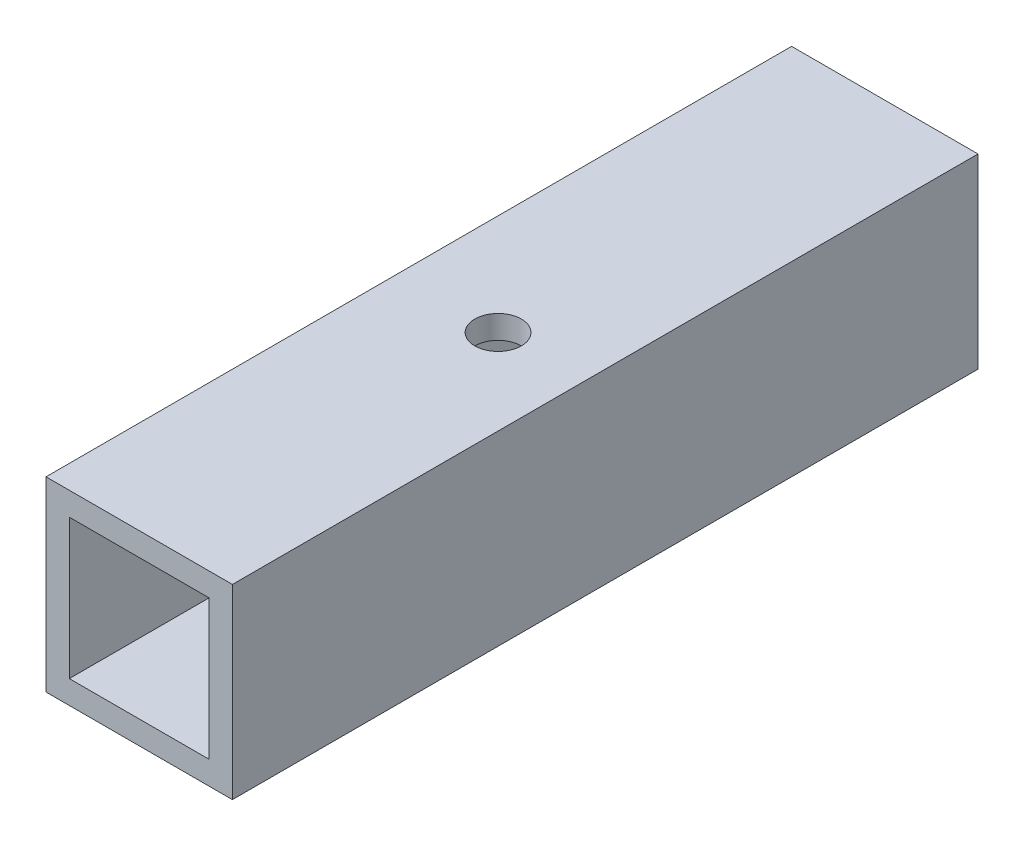
ISO-10303-21;
HEADER;
FILE_DESCRIPTION(('STEP AP214'),'2;1');
FILE_NAME('part.step','',(''),(''),'','','');
FILE_SCHEMA(('AUTOMOTIVE_DESIGN { 1 0 10303 214 1 1 1 1 }'));
ENDSEC;
DATA;
#1=APPLICATION_CONTEXT('core data for automotive mechanical design processes');
#2=APPLICATION_PROTOCOL_DEFINITION('international standard','automotive_design',2000,#1);
#3=PRODUCT_CONTEXT('',#1,'mechanical');
#4=PRODUCT('Part','Part','',(#3));
#5=PRODUCT_RELATED_PRODUCT_CATEGORY('part','',(#4));
#6=PRODUCT_DEFINITION_FORMATION('','',#4);
#7=PRODUCT_DEFINITION_CONTEXT('part definition',#1,'design');
#8=PRODUCT_DEFINITION('design','',#6,#7);
#9=PRODUCT_DEFINITION_SHAPE('','',#8);
#10=(LENGTH_UNIT() NAMED_UNIT(*) SI_UNIT(.MILLI.,.METRE.));
#11=(NAMED_UNIT(*) PLANE_ANGLE_UNIT() SI_UNIT($,.RADIAN.));
#12=(NAMED_UNIT(*) SI_UNIT($,.STERADIAN.) SOLID_ANGLE_UNIT());
#13=UNCERTAINTY_MEASURE_WITH_UNIT(LENGTH_MEASURE(1.E-05),#10,'distance_accuracy_value','');
#14=(GEOMETRIC_REPRESENTATION_CONTEXT(3) GLOBAL_UNCERTAINTY_ASSIGNED_CONTEXT((#13)) GLOBAL_UNIT_ASSIGNED_CONTEXT((#10,
#11,#12)) REPRESENTATION_CONTEXT('',''));
#15=CARTESIAN_POINT('',(0.,0.,0.));
#16=DIRECTION('',(0.,0.,1.));
#17=DIRECTION('',(1.,0.,0.));
#18=AXIS2_PLACEMENT_3D('',#15,#16,#17);
#19=CARTESIAN_POINT('',(0.,0.,101.6));
#20=DIRECTION('',(0.,0.,-1.));
#21=DIRECTION('',(-1.,0.,0.));
#22=AXIS2_PLACEMENT_3D('',#19,#20,#21);
#23=PLANE('',#22);
#24=DIRECTION('',(0.,-1.,0.));
#25=VECTOR('',#24,1.);
#26=CARTESIAN_POINT('',(0.,0.,101.6));
#27=LINE('',#26,#25);
#28=CARTESIAN_POINT('',(0.,25.4,101.6));
#29=VERTEX_POINT('',#28);
#30=CARTESIAN_POINT('',(0.,0.,101.6));
#31=VERTEX_POINT('',#30);
#32=EDGE_CURVE('E150',#29,#31,#27,.T.);
#33=ORIENTED_EDGE('',*,*,#32,.T.);
#34=DIRECTION('',(1.,0.,0.));
#35=VECTOR('',#34,1.);
#36=CARTESIAN_POINT('',(0.,0.,101.6));
#37=LINE('',#36,#35);
#38=CARTESIAN_POINT('',(25.4,0.,101.6));
#39=VERTEX_POINT('',#38);
#40=EDGE_CURVE('E154',#31,#39,#37,.T.);
#41=ORIENTED_EDGE('',*,*,#40,.T.);
#42=DIRECTION('',(0.,1.,0.));
#43=VECTOR('',#42,1.);
#44=CARTESIAN_POINT('',(25.4,0.,101.6));
#45=LINE('',#44,#43);
#46=CARTESIAN_POINT('',(25.4,25.4,101.6));
#47=VERTEX_POINT('',#46);
#48=EDGE_CURVE('E157',#39,#47,#45,.T.);
#49=ORIENTED_EDGE('',*,*,#48,.T.);
#50=DIRECTION('',(-1.,0.,0.));
#51=VECTOR('',#50,1.);
#52=CARTESIAN_POINT('',(0.,25.4,101.6));
#53=LINE('',#52,#51);
#54=EDGE_CURVE('E159',#47,#29,#53,.T.);
#55=ORIENTED_EDGE('',*,*,#54,.T.);
#56=EDGE_LOOP('',(#33,#41,#49,#55));
#57=FACE_BOUND('',#56,.T.);
#58=DIRECTION('',(0.,-1.,0.));
#59=VECTOR('',#58,1.);
#60=CARTESIAN_POINT('',(3.175,3.175,101.6));
#61=LINE('',#60,#59);
#62=CARTESIAN_POINT('',(3.175,22.225,101.6));
#63=VERTEX_POINT('',#62);
#64=CARTESIAN_POINT('',(3.175,3.175,101.6));
#65=VERTEX_POINT('',#64);
#66=EDGE_CURVE('E108',#63,#65,#61,.T.);
#67=ORIENTED_EDGE('',*,*,#66,.F.);
#68=DIRECTION('',(-1.,0.,0.));
#69=VECTOR('',#68,1.);
#70=CARTESIAN_POINT('',(3.175,22.225,101.6));
#71=LINE('',#70,#69);
#72=CARTESIAN_POINT('',(22.225,22.225,101.6));
#73=VERTEX_POINT('',#72);
#74=EDGE_CURVE('E132',#73,#63,#71,.T.);
#75=ORIENTED_EDGE('',*,*,#74,.F.);
#76=DIRECTION('',(0.,1.,0.));
#77=VECTOR('',#76,1.);
#78=CARTESIAN_POINT('',(22.225,3.175,101.6));
#79=LINE('',#78,#77);
#80=CARTESIAN_POINT('',(22.225,3.175,101.6));
#81=VERTEX_POINT('',#80);
#82=EDGE_CURVE('E130',#81,#73,#79,.T.);
#83=ORIENTED_EDGE('',*,*,#82,.F.);
#84=DIRECTION('',(1.,0.,0.));
#85=VECTOR('',#84,1.);
#86=CARTESIAN_POINT('',(3.175,3.175,101.6));
#87=LINE('',#86,#85);
#88=EDGE_CURVE('E117',#65,#81,#87,.T.);
#89=ORIENTED_EDGE('',*,*,#88,.F.);
#90=EDGE_LOOP('',(#67,#75,#83,#89));
#91=FACE_BOUND('',#90,.T.);
#92=ADVANCED_FACE('F39',(#57,#91),#23,.F.);
#93=CARTESIAN_POINT('',(0.,0.,0.));
#94=DIRECTION('',(0.,0.,-1.));
#95=DIRECTION('',(-1.,0.,0.));
#96=AXIS2_PLACEMENT_3D('',#93,#94,#95);
#97=PLANE('',#96);
#98=DIRECTION('',(0.,-1.,0.));
#99=VECTOR('',#98,1.);
#100=CARTESIAN_POINT('',(0.,0.,0.));
#101=LINE('',#100,#99);
#102=CARTESIAN_POINT('',(0.,25.4,0.));
#103=VERTEX_POINT('',#102);
#104=CARTESIAN_POINT('',(0.,0.,0.));
#105=VERTEX_POINT('',#104);
#106=EDGE_CURVE('E126',#103,#105,#101,.T.);
#107=ORIENTED_EDGE('',*,*,#106,.F.);
#108=DIRECTION('',(-1.,0.,0.));
#109=VECTOR('',#108,1.);
#110=CARTESIAN_POINT('',(0.,25.4,0.));
#111=LINE('',#110,#109);
#112=CARTESIAN_POINT('',(25.4,25.4,0.));
#113=VERTEX_POINT('',#112);
#114=EDGE_CURVE('E155',#113,#103,#111,.T.);
#115=ORIENTED_EDGE('',*,*,#114,.F.);
#116=DIRECTION('',(0.,1.,0.));
#117=VECTOR('',#116,1.);
#118=CARTESIAN_POINT('',(25.4,0.,0.));
#119=LINE('',#118,#117);
#120=CARTESIAN_POINT('',(25.4,0.,0.));
#121=VERTEX_POINT('',#120);
#122=EDGE_CURVE('E167',#121,#113,#119,.T.);
#123=ORIENTED_EDGE('',*,*,#122,.F.);
#124=DIRECTION('',(1.,0.,0.));
#125=VECTOR('',#124,1.);
#126=CARTESIAN_POINT('',(0.,0.,0.));
#127=LINE('',#126,#125);
#128=EDGE_CURVE('E165',#105,#121,#127,.T.);
#129=ORIENTED_EDGE('',*,*,#128,.F.);
#130=EDGE_LOOP('',(#107,#115,#123,#129));
#131=FACE_BOUND('',#130,.T.);
#132=DIRECTION('',(-1.,0.,0.));
#133=VECTOR('',#132,1.);
#134=CARTESIAN_POINT('',(3.175,22.225,0.));
#135=LINE('',#134,#133);
#136=CARTESIAN_POINT('',(22.225,22.225,0.));
#137=VERTEX_POINT('',#136);
#138=CARTESIAN_POINT('',(3.175,22.225,0.));
#139=VERTEX_POINT('',#138);
#140=EDGE_CURVE('E118',#137,#139,#135,.T.);
#141=ORIENTED_EDGE('',*,*,#140,.T.);
#142=DIRECTION('',(0.,-1.,0.));
#143=VECTOR('',#142,1.);
#144=CARTESIAN_POINT('',(3.175,3.175,0.));
#145=LINE('',#144,#143);
#146=CARTESIAN_POINT('',(3.175,3.175,0.));
#147=VERTEX_POINT('',#146);
#148=EDGE_CURVE('E63',#139,#147,#145,.T.);
#149=ORIENTED_EDGE('',*,*,#148,.T.);
#150=DIRECTION('',(1.,0.,0.));
#151=VECTOR('',#150,1.);
#152=CARTESIAN_POINT('',(3.175,3.175,0.));
#153=LINE('',#152,#151);
#154=CARTESIAN_POINT('',(22.225,3.175,0.));
#155=VERTEX_POINT('',#154);
#156=EDGE_CURVE('E124',#147,#155,#153,.T.);
#157=ORIENTED_EDGE('',*,*,#156,.T.);
#158=DIRECTION('',(0.,1.,0.));
#159=VECTOR('',#158,1.);
#160=CARTESIAN_POINT('',(22.225,3.175,0.));
#161=LINE('',#160,#159);
#162=EDGE_CURVE('E141',#155,#137,#161,.T.);
#163=ORIENTED_EDGE('',*,*,#162,.T.);
#164=EDGE_LOOP('',(#141,#149,#157,#163));
#165=FACE_BOUND('',#164,.T.);
#166=ADVANCED_FACE('F187',(#131,#165),#97,.T.);
#167=CARTESIAN_POINT('',(0.,0.,101.6));
#168=DIRECTION('',(1.,0.,0.));
#169=DIRECTION('',(0.,0.,-1.));
#170=AXIS2_PLACEMENT_3D('',#167,#168,#169);
#171=PLANE('',#170);
#172=ORIENTED_EDGE('',*,*,#106,.T.);
#173=DIRECTION('',(0.,0.,-1.));
#174=VECTOR('',#173,1.);
#175=CARTESIAN_POINT('',(0.,0.,101.6));
#176=LINE('',#175,#174);
#177=EDGE_CURVE('E11',#31,#105,#176,.T.);
#178=ORIENTED_EDGE('',*,*,#177,.F.);
#179=ORIENTED_EDGE('',*,*,#32,.F.);
#180=DIRECTION('',(0.,0.,-1.));
#181=VECTOR('',#180,1.);
#182=CARTESIAN_POINT('',(0.,25.4,101.6));
#183=LINE('',#182,#181);
#184=EDGE_CURVE('E162',#29,#103,#183,.T.);
#185=ORIENTED_EDGE('',*,*,#184,.T.);
#186=EDGE_LOOP('',(#172,#178,#179,#185));
#187=FACE_BOUND('',#186,.T.);
#188=ADVANCED_FACE('F41',(#187),#171,.F.);
#189=CARTESIAN_POINT('',(0.,0.,101.6));
#190=DIRECTION('',(0.,1.,0.));
#191=DIRECTION('',(0.,0.,1.));
#192=AXIS2_PLACEMENT_3D('',#189,#190,#191);
#193=PLANE('',#192);
#194=CARTESIAN_POINT('',(13.7663674383033,0.,53.7644274293484));
#195=DIRECTION('',(0.,1.,0.));
#196=DIRECTION('',(-0.800064361150527,0.,-0.599914175542468));
#197=AXIS2_PLACEMENT_3D('',#194,#195,#196);
#198=ELLIPSE('',#197,3.17499999999999,3.17364205225337);
#199=CARTESIAN_POINT('',(11.2261630916504,0.,51.8596999220011));
#200=VERTEX_POINT('',#199);
#201=EDGE_CURVE('E139',#200,#200,#198,.T.);
#202=ORIENTED_EDGE('',*,*,#201,.T.);
#203=EDGE_LOOP('',(#202));
#204=FACE_BOUND('',#203,.T.);
#205=ORIENTED_EDGE('',*,*,#128,.T.);
#206=DIRECTION('',(0.,0.,-1.));
#207=VECTOR('',#206,1.);
#208=CARTESIAN_POINT('',(25.4,0.,101.6));
#209=LINE('',#208,#207);
#210=EDGE_CURVE('E48',#39,#121,#209,.T.);
#211=ORIENTED_EDGE('',*,*,#210,.F.);
#212=ORIENTED_EDGE('',*,*,#40,.F.);
#213=ORIENTED_EDGE('',*,*,#177,.T.);
#214=EDGE_LOOP('',(#205,#211,#212,#213));
#215=FACE_BOUND('',#214,.T.);
#216=ADVANCED_FACE('F197',(#204,#215),#193,.F.);
#217=CARTESIAN_POINT('',(25.4,0.,101.6));
#218=DIRECTION('',(-1.,0.,0.));
#219=DIRECTION('',(0.,0.,1.));
#220=AXIS2_PLACEMENT_3D('',#217,#218,#219);
#221=PLANE('',#220);
#222=ORIENTED_EDGE('',*,*,#122,.T.);
#223=DIRECTION('',(0.,0.,-1.));
#224=VECTOR('',#223,1.);
#225=CARTESIAN_POINT('',(25.4,25.4,101.6));
#226=LINE('',#225,#224);
#227=EDGE_CURVE('E173',#47,#113,#226,.T.);
#228=ORIENTED_EDGE('',*,*,#227,.F.);
#229=ORIENTED_EDGE('',*,*,#48,.F.);
#230=ORIENTED_EDGE('',*,*,#210,.T.);
#231=EDGE_LOOP('',(#222,#228,#229,#230));
#232=FACE_BOUND('',#231,.T.);
#233=ADVANCED_FACE('F181',(#232),#221,.F.);
#234=CARTESIAN_POINT('',(0.,25.4,101.6));
#235=DIRECTION('',(0.,-1.,0.));
#236=DIRECTION('',(0.,0.,-1.));
#237=AXIS2_PLACEMENT_3D('',#234,#235,#236);
#238=PLANE('',#237);
#239=CARTESIAN_POINT('',(13.7663674383033,25.4,53.7644274293484));
#240=DIRECTION('',(0.,1.,0.));
#241=DIRECTION('',(-0.800064361150527,0.,-0.599914175542468));
#242=AXIS2_PLACEMENT_3D('',#239,#240,#241);
#243=ELLIPSE('',#242,3.17499999999999,3.17364205225337);
#244=CARTESIAN_POINT('',(11.2261630916504,25.4,51.8596999220011));
#245=VERTEX_POINT('',#244);
#246=EDGE_CURVE('E224',#245,#245,#243,.T.);
#247=ORIENTED_EDGE('',*,*,#246,.F.);
#248=EDGE_LOOP('',(#247));
#249=FACE_BOUND('',#248,.T.);
#250=ORIENTED_EDGE('',*,*,#114,.T.);
#251=ORIENTED_EDGE('',*,*,#184,.F.);
#252=ORIENTED_EDGE('',*,*,#54,.F.);
#253=ORIENTED_EDGE('',*,*,#227,.T.);
#254=EDGE_LOOP('',(#250,#251,#252,#253));
#255=FACE_BOUND('',#254,.T.);
#256=ADVANCED_FACE('F191',(#249,#255),#238,.F.);
#257=CARTESIAN_POINT('',(3.175,3.175,101.6));
#258=DIRECTION('',(1.,0.,0.));
#259=DIRECTION('',(0.,0.,-1.));
#260=AXIS2_PLACEMENT_3D('',#257,#258,#259);
#261=PLANE('',#260);
#262=ORIENTED_EDGE('',*,*,#148,.F.);
#263=DIRECTION('',(0.,0.,-1.));
#264=VECTOR('',#263,1.);
#265=CARTESIAN_POINT('',(3.175,22.225,101.6));
#266=LINE('',#265,#264);
#267=EDGE_CURVE('E112',#63,#139,#266,.T.);
#268=ORIENTED_EDGE('',*,*,#267,.F.);
#269=ORIENTED_EDGE('',*,*,#66,.T.);
#270=DIRECTION('',(0.,0.,-1.));
#271=VECTOR('',#270,1.);
#272=CARTESIAN_POINT('',(3.175,3.175,101.6));
#273=LINE('',#272,#271);
#274=EDGE_CURVE('E111',#65,#147,#273,.T.);
#275=ORIENTED_EDGE('',*,*,#274,.T.);
#276=EDGE_LOOP('',(#262,#268,#269,#275));
#277=FACE_BOUND('',#276,.T.);
#278=ADVANCED_FACE('F110',(#277),#261,.T.);
#279=CARTESIAN_POINT('',(3.175,3.175,101.6));
#280=DIRECTION('',(0.,1.,0.));
#281=DIRECTION('',(0.,0.,1.));
#282=AXIS2_PLACEMENT_3D('',#279,#280,#281);
#283=PLANE('',#282);
#284=CARTESIAN_POINT('',(13.7663674383033,3.175,53.7644274293484));
#285=DIRECTION('',(0.,1.,0.));
#286=DIRECTION('',(-0.800064361150527,0.,-0.599914175542468));
#287=AXIS2_PLACEMENT_3D('',#284,#285,#286);
#288=ELLIPSE('',#287,3.17499999999999,3.17364205225337);
#289=CARTESIAN_POINT('',(11.2261630916504,3.175,51.8596999220011));
#290=VERTEX_POINT('',#289);
#291=EDGE_CURVE('E228',#290,#290,#288,.T.);
#292=ORIENTED_EDGE('',*,*,#291,.F.);
#293=EDGE_LOOP('',(#292));
#294=FACE_BOUND('',#293,.T.);
#295=ORIENTED_EDGE('',*,*,#156,.F.);
#296=ORIENTED_EDGE('',*,*,#274,.F.);
#297=ORIENTED_EDGE('',*,*,#88,.T.);
#298=DIRECTION('',(0.,0.,-1.));
#299=VECTOR('',#298,1.);
#300=CARTESIAN_POINT('',(22.225,3.175,101.6));
#301=LINE('',#300,#299);
#302=EDGE_CURVE('E127',#81,#155,#301,.T.);
#303=ORIENTED_EDGE('',*,*,#302,.T.);
#304=EDGE_LOOP('',(#295,#296,#297,#303));
#305=FACE_BOUND('',#304,.T.);
#306=ADVANCED_FACE('F121',(#294,#305),#283,.T.);
#307=CARTESIAN_POINT('',(22.225,3.175,101.6));
#308=DIRECTION('',(-1.,0.,0.));
#309=DIRECTION('',(0.,0.,1.));
#310=AXIS2_PLACEMENT_3D('',#307,#308,#309);
#311=PLANE('',#310);
#312=ORIENTED_EDGE('',*,*,#162,.F.);
#313=ORIENTED_EDGE('',*,*,#302,.F.);
#314=ORIENTED_EDGE('',*,*,#82,.T.);
#315=DIRECTION('',(0.,0.,-1.));
#316=VECTOR('',#315,1.);
#317=CARTESIAN_POINT('',(22.225,22.225,101.6));
#318=LINE('',#317,#316);
#319=EDGE_CURVE('E55',#73,#137,#318,.T.);
#320=ORIENTED_EDGE('',*,*,#319,.T.);
#321=EDGE_LOOP('',(#312,#313,#314,#320));
#322=FACE_BOUND('',#321,.T.);
#323=ADVANCED_FACE('F248',(#322),#311,.T.);
#324=CARTESIAN_POINT('',(3.175,22.225,101.6));
#325=DIRECTION('',(0.,-1.,0.));
#326=DIRECTION('',(0.,0.,-1.));
#327=AXIS2_PLACEMENT_3D('',#324,#325,#326);
#328=PLANE('',#327);
#329=CARTESIAN_POINT('',(13.7663674383033,22.225,53.7644274293484));
#330=DIRECTION('',(0.,1.,0.));
#331=DIRECTION('',(-0.800064361150527,0.,-0.599914175542468));
#332=AXIS2_PLACEMENT_3D('',#329,#330,#331);
#333=ELLIPSE('',#332,3.17499999999999,3.17364205225337);
#334=CARTESIAN_POINT('',(11.2261630916504,22.225,51.8596999220011));
#335=VERTEX_POINT('',#334);
#336=EDGE_CURVE('E43',#335,#335,#333,.F.);
#337=ORIENTED_EDGE('',*,*,#336,.F.);
#338=EDGE_LOOP('',(#337));
#339=FACE_BOUND('',#338,.T.);
#340=ORIENTED_EDGE('',*,*,#140,.F.);
#341=ORIENTED_EDGE('',*,*,#319,.F.);
#342=ORIENTED_EDGE('',*,*,#74,.T.);
#343=ORIENTED_EDGE('',*,*,#267,.T.);
#344=EDGE_LOOP('',(#340,#341,#342,#343));
#345=FACE_BOUND('',#344,.T.);
#346=ADVANCED_FACE('F243',(#339,#345),#328,.T.);
#347=CARTESIAN_POINT('',(13.7663674383033,-76.2,53.7644274293484));
#348=DIRECTION('',(0.,1.,0.));
#349=DIRECTION('',(-0.800064361150527,0.,-0.599914175542468));
#350=AXIS2_PLACEMENT_3D('',#347,#348,#349);
#351=ELLIPSE('',#350,3.17499999999999,3.17364205225337);
#352=DIRECTION('',(0.,1.,0.));
#353=VECTOR('',#352,1.);
#354=SURFACE_OF_LINEAR_EXTRUSION('',#351,#353);
#355=ORIENTED_EDGE('',*,*,#336,.T.);
#356=EDGE_LOOP('',(#355));
#357=FACE_BOUND('',#356,.T.);
#358=ORIENTED_EDGE('',*,*,#246,.T.);
#359=EDGE_LOOP('',(#358));
#360=FACE_BOUND('',#359,.T.);
#361=ADVANCED_FACE('F237',(#357,#360),#354,.F.);
#362=ORIENTED_EDGE('',*,*,#291,.T.);
#363=EDGE_LOOP('',(#362));
#364=FACE_BOUND('',#363,.T.);
#365=ORIENTED_EDGE('',*,*,#201,.F.);
#366=EDGE_LOOP('',(#365));
#367=FACE_BOUND('',#366,.T.);
#368=ADVANCED_FACE('F235',(#364,#367),#354,.F.);
#369=CLOSED_SHELL('',(#92,#166,#188,#216,#233,#256,#278,#306,#323,#346,#361,#368));
#370=MANIFOLD_SOLID_BREP('B2',#369);
#371=ADVANCED_BREP_SHAPE_REPRESENTATION('',(#18,#370),#14);
#372=SHAPE_DEFINITION_REPRESENTATION(#9,#371);
ENDSEC;
END-ISO-10303-21;
